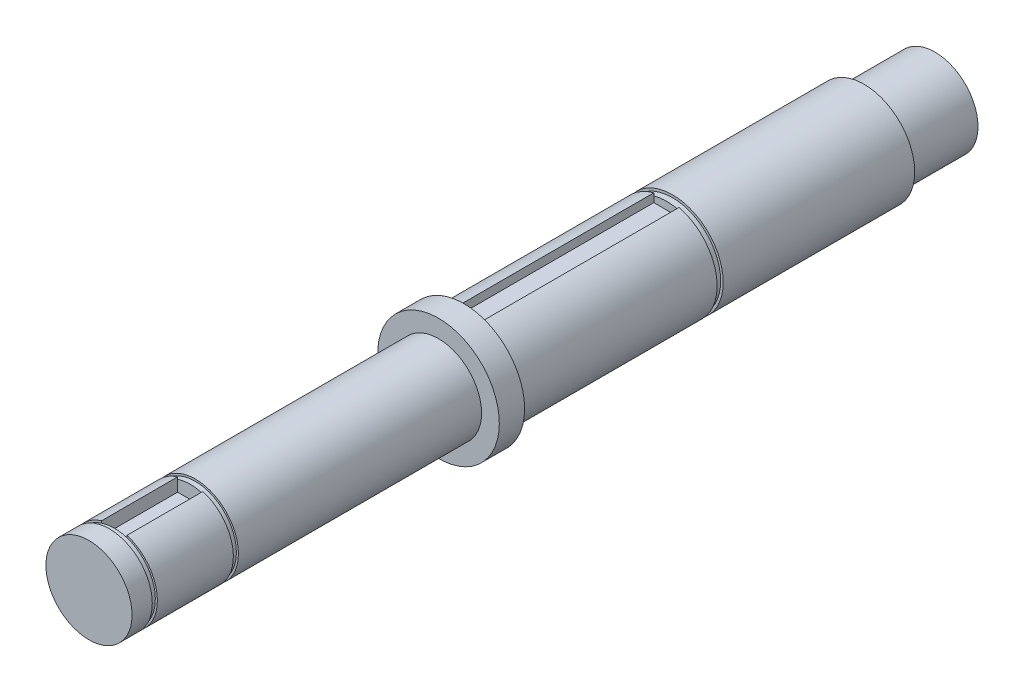
ISO-10303-21;
HEADER;
FILE_DESCRIPTION(('STEP AP214'),'2;1');
FILE_NAME('part.step','',(''),(''),'','','');
FILE_SCHEMA(('AUTOMOTIVE_DESIGN { 1 0 10303 214 1 1 1 1 }'));
ENDSEC;
DATA;
#1=APPLICATION_CONTEXT('core data for automotive mechanical design processes');
#2=APPLICATION_PROTOCOL_DEFINITION('international standard','automotive_design',2000,#1);
#3=PRODUCT_CONTEXT('',#1,'mechanical');
#4=PRODUCT('Part','Part','',(#3));
#5=PRODUCT_RELATED_PRODUCT_CATEGORY('part','',(#4));
#6=PRODUCT_DEFINITION_FORMATION('','',#4);
#7=PRODUCT_DEFINITION_CONTEXT('part definition',#1,'design');
#8=PRODUCT_DEFINITION('design','',#6,#7);
#9=PRODUCT_DEFINITION_SHAPE('','',#8);
#10=(LENGTH_UNIT() NAMED_UNIT(*) SI_UNIT(.MILLI.,.METRE.));
#11=(NAMED_UNIT(*) PLANE_ANGLE_UNIT() SI_UNIT($,.RADIAN.));
#12=(NAMED_UNIT(*) SI_UNIT($,.STERADIAN.) SOLID_ANGLE_UNIT());
#13=UNCERTAINTY_MEASURE_WITH_UNIT(LENGTH_MEASURE(1.E-05),#10,'distance_accuracy_value','');
#14=(GEOMETRIC_REPRESENTATION_CONTEXT(3) GLOBAL_UNCERTAINTY_ASSIGNED_CONTEXT((#13)) GLOBAL_UNIT_ASSIGNED_CONTEXT((#10,
#11,#12)) REPRESENTATION_CONTEXT('',''));
#15=CARTESIAN_POINT('',(0.,0.,0.));
#16=DIRECTION('',(0.,0.,1.));
#17=DIRECTION('',(1.,0.,0.));
#18=AXIS2_PLACEMENT_3D('',#15,#16,#17);
#19=CARTESIAN_POINT('',(0.,0.,0.));
#20=DIRECTION('',(0.,0.,1.));
#21=DIRECTION('',(1.,0.,0.));
#22=AXIS2_PLACEMENT_3D('',#19,#20,#21);
#23=CYLINDRICAL_SURFACE('',#22,8.49999999999999);
#24=CARTESIAN_POINT('',(0.,0.,-14.));
#25=DIRECTION('',(0.,0.,1.));
#26=DIRECTION('',(1.,0.,0.));
#27=AXIS2_PLACEMENT_3D('',#24,#25,#26);
#28=CIRCLE('',#27,8.49999999999999);
#29=CARTESIAN_POINT('',(8.49999999999999,0.,-14.));
#30=VERTEX_POINT('',#29);
#31=EDGE_CURVE('E267',#30,#30,#28,.T.);
#32=ORIENTED_EDGE('',*,*,#31,.T.);
#33=EDGE_LOOP('',(#32));
#34=FACE_BOUND('',#33,.T.);
#35=CARTESIAN_POINT('',(0.,0.,34.));
#36=DIRECTION('',(0.,0.,1.));
#37=DIRECTION('',(1.,0.,0.));
#38=AXIS2_PLACEMENT_3D('',#35,#36,#37);
#39=CIRCLE('',#38,8.49999999999999);
#40=CARTESIAN_POINT('',(8.49999999999999,0.,34.));
#41=VERTEX_POINT('',#40);
#42=EDGE_CURVE('E54',#41,#41,#39,.T.);
#43=ORIENTED_EDGE('',*,*,#42,.F.);
#44=EDGE_LOOP('',(#43));
#45=FACE_BOUND('',#44,.T.);
#46=ADVANCED_FACE('F50',(#34,#45),#23,.T.);
#47=CARTESIAN_POINT('',(0.,0.,-59.));
#48=DIRECTION('',(0.,0.,1.));
#49=DIRECTION('',(1.,0.,0.));
#50=AXIS2_PLACEMENT_3D('',#47,#48,#49);
#51=PLANE('',#50);
#52=DIRECTION('',(0.,1.,0.));
#53=VECTOR('',#52,1.);
#54=CARTESIAN_POINT('',(2.5,8.,-59.));
#55=LINE('',#54,#53);
#56=CARTESIAN_POINT('',(2.5,8.,-59.));
#57=VERTEX_POINT('',#56);
#58=CARTESIAN_POINT('',(2.5,9.16515138991168,-59.));
#59=VERTEX_POINT('',#58);
#60=EDGE_CURVE('E213',#57,#59,#55,.T.);
#61=ORIENTED_EDGE('',*,*,#60,.T.);
#62=CARTESIAN_POINT('',(0.,0.,-59.));
#63=DIRECTION('',(0.,0.,1.));
#64=DIRECTION('',(1.,0.,0.));
#65=AXIS2_PLACEMENT_3D('',#62,#63,#64);
#66=CIRCLE('',#65,9.5);
#67=CARTESIAN_POINT('',(-2.5,9.16515138991168,-59.));
#68=VERTEX_POINT('',#67);
#69=EDGE_CURVE('E205',#59,#68,#66,.T.);
#70=ORIENTED_EDGE('',*,*,#69,.T.);
#71=DIRECTION('',(0.,-1.,0.));
#72=VECTOR('',#71,1.);
#73=CARTESIAN_POINT('',(-2.5,8.,-59.));
#74=LINE('',#73,#72);
#75=CARTESIAN_POINT('',(-2.5,8.,-59.));
#76=VERTEX_POINT('',#75);
#77=EDGE_CURVE('E217',#68,#76,#74,.T.);
#78=ORIENTED_EDGE('',*,*,#77,.T.);
#79=DIRECTION('',(1.,0.,0.));
#80=VECTOR('',#79,1.);
#81=CARTESIAN_POINT('',(2.5,8.,-59.));
#82=LINE('',#81,#80);
#83=EDGE_CURVE('E223',#76,#57,#82,.T.);
#84=ORIENTED_EDGE('',*,*,#83,.T.);
#85=EDGE_LOOP('',(#61,#70,#78,#84));
#86=FACE_BOUND('',#85,.T.);
#87=ADVANCED_FACE('F357',(#86),#51,.T.);
#88=CARTESIAN_POINT('',(0.,8.49999999999999,-14.));
#89=DIRECTION('',(0.,0.,-1.));
#90=DIRECTION('',(-1.,0.,0.));
#91=AXIS2_PLACEMENT_3D('',#88,#89,#90);
#92=PLANE('',#91);
#93=ORIENTED_EDGE('',*,*,#31,.F.);
#94=EDGE_LOOP('',(#93));
#95=FACE_BOUND('',#94,.T.);
#96=CARTESIAN_POINT('',(0.,0.,-14.));
#97=DIRECTION('',(0.,0.,1.));
#98=DIRECTION('',(1.,0.,0.));
#99=AXIS2_PLACEMENT_3D('',#96,#97,#98);
#100=CIRCLE('',#99,12.);
#101=CARTESIAN_POINT('',(12.,0.,-14.));
#102=VERTEX_POINT('',#101);
#103=EDGE_CURVE('E263',#102,#102,#100,.T.);
#104=ORIENTED_EDGE('',*,*,#103,.T.);
#105=EDGE_LOOP('',(#104));
#106=FACE_BOUND('',#105,.T.);
#107=ADVANCED_FACE('F383',(#95,#106),#92,.F.);
#108=CARTESIAN_POINT('',(0.,0.,0.));
#109=DIRECTION('',(0.,0.,1.));
#110=DIRECTION('',(1.,0.,0.));
#111=AXIS2_PLACEMENT_3D('',#108,#109,#110);
#112=CYLINDRICAL_SURFACE('',#111,12.);
#113=ORIENTED_EDGE('',*,*,#103,.F.);
#114=EDGE_LOOP('',(#113));
#115=FACE_BOUND('',#114,.T.);
#116=CARTESIAN_POINT('',(0.,0.,-19.));
#117=DIRECTION('',(0.,0.,1.));
#118=DIRECTION('',(1.,0.,0.));
#119=AXIS2_PLACEMENT_3D('',#116,#117,#118);
#120=CIRCLE('',#119,12.);
#121=CARTESIAN_POINT('',(12.,0.,-19.));
#122=VERTEX_POINT('',#121);
#123=EDGE_CURVE('E259',#122,#122,#120,.T.);
#124=ORIENTED_EDGE('',*,*,#123,.T.);
#125=EDGE_LOOP('',(#124));
#126=FACE_BOUND('',#125,.T.);
#127=ADVANCED_FACE('F638',(#115,#126),#112,.T.);
#128=CARTESIAN_POINT('',(0.,12.,-19.));
#129=DIRECTION('',(0.,0.,1.));
#130=DIRECTION('',(1.,0.,0.));
#131=AXIS2_PLACEMENT_3D('',#128,#129,#130);
#132=PLANE('',#131);
#133=ORIENTED_EDGE('',*,*,#123,.F.);
#134=EDGE_LOOP('',(#133));
#135=FACE_BOUND('',#134,.T.);
#136=CARTESIAN_POINT('',(0.,0.,-19.));
#137=DIRECTION('',(0.,0.,1.));
#138=DIRECTION('',(1.,0.,0.));
#139=AXIS2_PLACEMENT_3D('',#136,#137,#138);
#140=CIRCLE('',#139,9.99999999999999);
#141=CARTESIAN_POINT('',(-2.5,9.68245836551853,-19.));
#142=VERTEX_POINT('',#141);
#143=CARTESIAN_POINT('',(2.5,9.68245836551853,-19.));
#144=VERTEX_POINT('',#143);
#145=EDGE_CURVE('E255',#142,#144,#140,.T.);
#146=ORIENTED_EDGE('',*,*,#145,.T.);
#147=DIRECTION('',(0.,1.,0.));
#148=VECTOR('',#147,1.);
#149=CARTESIAN_POINT('',(2.5,8.,-19.));
#150=LINE('',#149,#148);
#151=CARTESIAN_POINT('',(2.5,8.,-19.));
#152=VERTEX_POINT('',#151);
#153=EDGE_CURVE('E228',#152,#144,#150,.T.);
#154=ORIENTED_EDGE('',*,*,#153,.F.);
#155=DIRECTION('',(1.,0.,0.));
#156=VECTOR('',#155,1.);
#157=CARTESIAN_POINT('',(2.5,8.,-19.));
#158=LINE('',#157,#156);
#159=CARTESIAN_POINT('',(-2.5,8.,-19.));
#160=VERTEX_POINT('',#159);
#161=EDGE_CURVE('E234',#160,#152,#158,.T.);
#162=ORIENTED_EDGE('',*,*,#161,.F.);
#163=DIRECTION('',(0.,-1.,0.));
#164=VECTOR('',#163,1.);
#165=CARTESIAN_POINT('',(-2.5,8.,-19.));
#166=LINE('',#165,#164);
#167=EDGE_CURVE('E231',#142,#160,#166,.T.);
#168=ORIENTED_EDGE('',*,*,#167,.F.);
#169=EDGE_LOOP('',(#146,#154,#162,#168));
#170=FACE_BOUND('',#169,.T.);
#171=ADVANCED_FACE('F348',(#135,#170),#132,.F.);
#172=CARTESIAN_POINT('',(0.,0.,0.));
#173=DIRECTION('',(0.,0.,1.));
#174=DIRECTION('',(1.,0.,0.));
#175=AXIS2_PLACEMENT_3D('',#172,#173,#174);
#176=CYLINDRICAL_SURFACE('',#175,9.99999999999999);
#177=DIRECTION('',(0.,0.,1.));
#178=VECTOR('',#177,1.);
#179=CARTESIAN_POINT('',(-2.5,9.68245836551853,0.));
#180=LINE('',#179,#178);
#181=CARTESIAN_POINT('',(-2.5,9.68245836551853,-59.));
#182=VERTEX_POINT('',#181);
#183=EDGE_CURVE('E271',#142,#182,#180,.F.);
#184=ORIENTED_EDGE('',*,*,#183,.T.);
#185=CARTESIAN_POINT('',(0.,0.,-59.));
#186=DIRECTION('',(0.,0.,1.));
#187=DIRECTION('',(1.,0.,0.));
#188=AXIS2_PLACEMENT_3D('',#185,#186,#187);
#189=CIRCLE('',#188,9.99999999999999);
#190=CARTESIAN_POINT('',(2.5,9.68245836551853,-59.));
#191=VERTEX_POINT('',#190);
#192=EDGE_CURVE('E204',#182,#191,#189,.T.);
#193=ORIENTED_EDGE('',*,*,#192,.T.);
#194=DIRECTION('',(0.,0.,1.));
#195=VECTOR('',#194,1.);
#196=CARTESIAN_POINT('',(2.5,9.68245836551853,0.));
#197=LINE('',#196,#195);
#198=EDGE_CURVE('E275',#191,#144,#197,.T.);
#199=ORIENTED_EDGE('',*,*,#198,.T.);
#200=ORIENTED_EDGE('',*,*,#145,.F.);
#201=EDGE_LOOP('',(#184,#193,#199,#200));
#202=FACE_BOUND('',#201,.T.);
#203=ADVANCED_FACE('F341',(#202),#176,.T.);
#204=CARTESIAN_POINT('',(2.5,8.,-59.));
#205=DIRECTION('',(1.,0.,0.));
#206=DIRECTION('',(0.,0.,-1.));
#207=AXIS2_PLACEMENT_3D('',#204,#205,#206);
#208=PLANE('',#207);
#209=ORIENTED_EDGE('',*,*,#60,.F.);
#210=DIRECTION('',(0.,0.,1.));
#211=VECTOR('',#210,1.);
#212=CARTESIAN_POINT('',(2.5,8.,-59.));
#213=LINE('',#212,#211);
#214=EDGE_CURVE('E238',#57,#152,#213,.T.);
#215=ORIENTED_EDGE('',*,*,#214,.T.);
#216=ORIENTED_EDGE('',*,*,#153,.T.);
#217=ORIENTED_EDGE('',*,*,#198,.F.);
#218=EDGE_CURVE('E218',#59,#191,#55,.T.);
#219=ORIENTED_EDGE('',*,*,#218,.F.);
#220=EDGE_LOOP('',(#209,#215,#216,#217,#219));
#221=FACE_BOUND('',#220,.T.);
#222=ADVANCED_FACE('F344',(#221),#208,.F.);
#223=CARTESIAN_POINT('',(-2.5,8.,-59.));
#224=DIRECTION('',(-1.,0.,0.));
#225=DIRECTION('',(0.,-1.,0.));
#226=AXIS2_PLACEMENT_3D('',#223,#224,#225);
#227=PLANE('',#226);
#228=ORIENTED_EDGE('',*,*,#167,.T.);
#229=DIRECTION('',(0.,0.,1.));
#230=VECTOR('',#229,1.);
#231=CARTESIAN_POINT('',(-2.5,8.,-59.));
#232=LINE('',#231,#230);
#233=EDGE_CURVE('E227',#76,#160,#232,.T.);
#234=ORIENTED_EDGE('',*,*,#233,.F.);
#235=ORIENTED_EDGE('',*,*,#77,.F.);
#236=EDGE_CURVE('E219',#182,#68,#74,.T.);
#237=ORIENTED_EDGE('',*,*,#236,.F.);
#238=ORIENTED_EDGE('',*,*,#183,.F.);
#239=EDGE_LOOP('',(#228,#234,#235,#237,#238));
#240=FACE_BOUND('',#239,.T.);
#241=ADVANCED_FACE('F355',(#240),#227,.F.);
#242=CARTESIAN_POINT('',(2.5,8.,-59.));
#243=DIRECTION('',(0.,-1.,0.));
#244=DIRECTION('',(0.,0.,-1.));
#245=AXIS2_PLACEMENT_3D('',#242,#243,#244);
#246=PLANE('',#245);
#247=ORIENTED_EDGE('',*,*,#161,.T.);
#248=ORIENTED_EDGE('',*,*,#214,.F.);
#249=ORIENTED_EDGE('',*,*,#83,.F.);
#250=ORIENTED_EDGE('',*,*,#233,.T.);
#251=EDGE_LOOP('',(#247,#248,#249,#250));
#252=FACE_BOUND('',#251,.T.);
#253=ADVANCED_FACE('F350',(#252),#246,.F.);
#254=CARTESIAN_POINT('',(0.,0.,-60.2));
#255=DIRECTION('',(0.,0.,1.));
#256=DIRECTION('',(1.,0.,0.));
#257=AXIS2_PLACEMENT_3D('',#254,#255,#256);
#258=PLANE('',#257);
#259=CARTESIAN_POINT('',(0.,0.,-60.2));
#260=DIRECTION('',(0.,0.,1.));
#261=DIRECTION('',(1.,0.,0.));
#262=AXIS2_PLACEMENT_3D('',#259,#260,#261);
#263=CIRCLE('',#262,9.5);
#264=CARTESIAN_POINT('',(9.5,0.,-60.2));
#265=VERTEX_POINT('',#264);
#266=EDGE_CURVE('E200',#265,#265,#263,.T.);
#267=ORIENTED_EDGE('',*,*,#266,.F.);
#268=EDGE_LOOP('',(#267));
#269=FACE_BOUND('',#268,.T.);
#270=CARTESIAN_POINT('',(0.,0.,-60.2));
#271=DIRECTION('',(0.,0.,1.));
#272=DIRECTION('',(1.,0.,0.));
#273=AXIS2_PLACEMENT_3D('',#270,#271,#272);
#274=CIRCLE('',#273,9.99999999999999);
#275=CARTESIAN_POINT('',(9.99999999999999,0.,-60.2));
#276=VERTEX_POINT('',#275);
#277=EDGE_CURVE('E212',#276,#276,#274,.T.);
#278=ORIENTED_EDGE('',*,*,#277,.T.);
#279=EDGE_LOOP('',(#278));
#280=FACE_BOUND('',#279,.T.);
#281=ADVANCED_FACE('F373',(#269,#280),#258,.T.);
#282=CARTESIAN_POINT('',(0.,0.,-59.));
#283=DIRECTION('',(0.,0.,1.));
#284=DIRECTION('',(1.,0.,0.));
#285=AXIS2_PLACEMENT_3D('',#282,#283,#284);
#286=PLANE('',#285);
#287=ORIENTED_EDGE('',*,*,#192,.F.);
#288=ORIENTED_EDGE('',*,*,#236,.T.);
#289=EDGE_CURVE('E199',#68,#59,#66,.T.);
#290=ORIENTED_EDGE('',*,*,#289,.T.);
#291=ORIENTED_EDGE('',*,*,#218,.T.);
#292=EDGE_LOOP('',(#287,#288,#290,#291));
#293=FACE_BOUND('',#292,.T.);
#294=ADVANCED_FACE('F334',(#293),#286,.F.);
#295=CARTESIAN_POINT('',(0.,0.,-60.2));
#296=DIRECTION('',(0.,0.,1.));
#297=DIRECTION('',(1.,0.,0.));
#298=AXIS2_PLACEMENT_3D('',#295,#296,#297);
#299=CYLINDRICAL_SURFACE('',#298,9.5);
#300=ORIENTED_EDGE('',*,*,#266,.T.);
#301=EDGE_LOOP('',(#300));
#302=FACE_BOUND('',#301,.T.);
#303=ORIENTED_EDGE('',*,*,#69,.F.);
#304=ORIENTED_EDGE('',*,*,#289,.F.);
#305=EDGE_LOOP('',(#303,#304));
#306=FACE_BOUND('',#305,.T.);
#307=ADVANCED_FACE('F359',(#302,#306),#299,.T.);
#308=CARTESIAN_POINT('',(0.,8.49999999999997,-112.));
#309=DIRECTION('',(0.,0.,1.));
#310=DIRECTION('',(1.,0.,0.));
#311=AXIS2_PLACEMENT_3D('',#308,#309,#310);
#312=PLANE('',#311);
#313=CARTESIAN_POINT('',(0.,0.,-112.));
#314=DIRECTION('',(0.,0.,1.));
#315=DIRECTION('',(1.,0.,0.));
#316=AXIS2_PLACEMENT_3D('',#313,#314,#315);
#317=CIRCLE('',#316,8.49999999999997);
#318=CARTESIAN_POINT('',(8.49999999999997,0.,-112.));
#319=VERTEX_POINT('',#318);
#320=EDGE_CURVE('E241',#319,#319,#317,.T.);
#321=ORIENTED_EDGE('',*,*,#320,.F.);
#322=EDGE_LOOP('',(#321));
#323=FACE_BOUND('',#322,.T.);
#324=ADVANCED_FACE('F363',(#323),#312,.F.);
#325=CARTESIAN_POINT('',(0.,0.,0.));
#326=DIRECTION('',(0.,0.,1.));
#327=DIRECTION('',(1.,0.,0.));
#328=AXIS2_PLACEMENT_3D('',#325,#326,#327);
#329=CYLINDRICAL_SURFACE('',#328,8.49999999999997);
#330=CARTESIAN_POINT('',(0.,0.,-98.));
#331=DIRECTION('',(0.,0.,1.));
#332=DIRECTION('',(1.,0.,0.));
#333=AXIS2_PLACEMENT_3D('',#330,#331,#332);
#334=CIRCLE('',#333,8.49999999999997);
#335=CARTESIAN_POINT('',(8.49999999999997,0.,-98.));
#336=VERTEX_POINT('',#335);
#337=EDGE_CURVE('E248',#336,#336,#334,.T.);
#338=ORIENTED_EDGE('',*,*,#337,.F.);
#339=EDGE_LOOP('',(#338));
#340=FACE_BOUND('',#339,.T.);
#341=ORIENTED_EDGE('',*,*,#320,.T.);
#342=EDGE_LOOP('',(#341));
#343=FACE_BOUND('',#342,.T.);
#344=ADVANCED_FACE('F370',(#340,#343),#329,.T.);
#345=CARTESIAN_POINT('',(0.,9.99999999999999,-98.));
#346=DIRECTION('',(0.,0.,1.));
#347=DIRECTION('',(1.,0.,0.));
#348=AXIS2_PLACEMENT_3D('',#345,#346,#347);
#349=PLANE('',#348);
#350=CARTESIAN_POINT('',(0.,0.,-98.));
#351=DIRECTION('',(0.,0.,1.));
#352=DIRECTION('',(1.,0.,0.));
#353=AXIS2_PLACEMENT_3D('',#350,#351,#352);
#354=CIRCLE('',#353,9.99999999999999);
#355=CARTESIAN_POINT('',(9.99999999999999,0.,-98.));
#356=VERTEX_POINT('',#355);
#357=EDGE_CURVE('E251',#356,#356,#354,.T.);
#358=ORIENTED_EDGE('',*,*,#357,.F.);
#359=EDGE_LOOP('',(#358));
#360=FACE_BOUND('',#359,.T.);
#361=ORIENTED_EDGE('',*,*,#337,.T.);
#362=EDGE_LOOP('',(#361));
#363=FACE_BOUND('',#362,.T.);
#364=ADVANCED_FACE('F551',(#360,#363),#349,.F.);
#365=ORIENTED_EDGE('',*,*,#357,.T.);
#366=EDGE_LOOP('',(#365));
#367=FACE_BOUND('',#366,.T.);
#368=ORIENTED_EDGE('',*,*,#277,.F.);
#369=EDGE_LOOP('',(#368));
#370=FACE_BOUND('',#369,.T.);
#371=ADVANCED_FACE('F312',(#367,#370),#176,.T.);
#372=CARTESIAN_POINT('',(0.,0.,34.));
#373=DIRECTION('',(0.,0.,1.));
#374=DIRECTION('',(1.,0.,0.));
#375=AXIS2_PLACEMENT_3D('',#372,#373,#374);
#376=PLANE('',#375);
#377=CARTESIAN_POINT('',(0.,0.,34.));
#378=DIRECTION('',(0.,0.,1.));
#379=DIRECTION('',(1.,0.,0.));
#380=AXIS2_PLACEMENT_3D('',#377,#378,#379);
#381=CIRCLE('',#380,8.1);
#382=CARTESIAN_POINT('',(8.1,0.,34.));
#383=VERTEX_POINT('',#382);
#384=EDGE_CURVE('E161',#383,#383,#381,.T.);
#385=ORIENTED_EDGE('',*,*,#384,.F.);
#386=EDGE_LOOP('',(#385));
#387=FACE_BOUND('',#386,.T.);
#388=ORIENTED_EDGE('',*,*,#42,.T.);
#389=EDGE_LOOP('',(#388));
#390=FACE_BOUND('',#389,.T.);
#391=ADVANCED_FACE('F309',(#387,#390),#376,.T.);
#392=CARTESIAN_POINT('',(0.,0.,35.));
#393=DIRECTION('',(0.,0.,1.));
#394=DIRECTION('',(1.,0.,0.));
#395=AXIS2_PLACEMENT_3D('',#392,#393,#394);
#396=PLANE('',#395);
#397=CARTESIAN_POINT('',(0.,0.,35.));
#398=DIRECTION('',(0.,0.,1.));
#399=DIRECTION('',(1.,0.,0.));
#400=AXIS2_PLACEMENT_3D('',#397,#398,#399);
#401=CIRCLE('',#400,8.1);
#402=CARTESIAN_POINT('',(-2.5,7.70454411370329,35.));
#403=VERTEX_POINT('',#402);
#404=CARTESIAN_POINT('',(2.5,7.70454411370329,35.));
#405=VERTEX_POINT('',#404);
#406=EDGE_CURVE('E138',#403,#405,#401,.T.);
#407=ORIENTED_EDGE('',*,*,#406,.T.);
#408=DIRECTION('',(0.,1.,0.));
#409=VECTOR('',#408,1.);
#410=CARTESIAN_POINT('',(2.5,8.49999999999999,35.));
#411=LINE('',#410,#409);
#412=CARTESIAN_POINT('',(2.5,8.12403840463595,35.));
#413=VERTEX_POINT('',#412);
#414=EDGE_CURVE('E179',#405,#413,#411,.T.);
#415=ORIENTED_EDGE('',*,*,#414,.T.);
#416=CARTESIAN_POINT('',(0.,0.,35.));
#417=DIRECTION('',(0.,0.,1.));
#418=DIRECTION('',(1.,0.,0.));
#419=AXIS2_PLACEMENT_3D('',#416,#417,#418);
#420=CIRCLE('',#419,8.49999999999999);
#421=CARTESIAN_POINT('',(-2.5,8.12403840463595,35.));
#422=VERTEX_POINT('',#421);
#423=EDGE_CURVE('E141',#422,#413,#420,.T.);
#424=ORIENTED_EDGE('',*,*,#423,.F.);
#425=DIRECTION('',(0.,-1.,0.));
#426=VECTOR('',#425,1.);
#427=CARTESIAN_POINT('',(-2.5,8.49999999999999,35.));
#428=LINE('',#427,#426);
#429=EDGE_CURVE('E136',#422,#403,#428,.T.);
#430=ORIENTED_EDGE('',*,*,#429,.T.);
#431=EDGE_LOOP('',(#407,#415,#424,#430));
#432=FACE_BOUND('',#431,.T.);
#433=ADVANCED_FACE('F137',(#432),#396,.F.);
#434=CARTESIAN_POINT('',(0.,0.,34.));
#435=DIRECTION('',(0.,0.,1.));
#436=DIRECTION('',(1.,0.,0.));
#437=AXIS2_PLACEMENT_3D('',#434,#435,#436);
#438=CYLINDRICAL_SURFACE('',#437,8.1);
#439=ORIENTED_EDGE('',*,*,#384,.T.);
#440=EDGE_LOOP('',(#439));
#441=FACE_BOUND('',#440,.T.);
#442=EDGE_CURVE('E67',#405,#403,#401,.T.);
#443=ORIENTED_EDGE('',*,*,#442,.F.);
#444=ORIENTED_EDGE('',*,*,#406,.F.);
#445=EDGE_LOOP('',(#443,#444));
#446=FACE_BOUND('',#445,.T.);
#447=ADVANCED_FACE('F150',(#441,#446),#438,.T.);
#448=CARTESIAN_POINT('',(0.,0.,55.));
#449=DIRECTION('',(0.,0.,1.));
#450=DIRECTION('',(1.,0.,0.));
#451=AXIS2_PLACEMENT_3D('',#448,#449,#450);
#452=PLANE('',#451);
#453=CARTESIAN_POINT('',(0.,0.,55.));
#454=DIRECTION('',(0.,0.,1.));
#455=DIRECTION('',(1.,0.,0.));
#456=AXIS2_PLACEMENT_3D('',#453,#454,#455);
#457=CIRCLE('',#456,8.49999999999999);
#458=CARTESIAN_POINT('',(8.49999999999999,0.,55.));
#459=VERTEX_POINT('',#458);
#460=EDGE_CURVE('E175',#459,#459,#457,.T.);
#461=ORIENTED_EDGE('',*,*,#460,.T.);
#462=EDGE_LOOP('',(#461));
#463=FACE_BOUND('',#462,.T.);
#464=ADVANCED_FACE('F387',(#463),#452,.T.);
#465=ORIENTED_EDGE('',*,*,#460,.F.);
#466=EDGE_LOOP('',(#465));
#467=FACE_BOUND('',#466,.T.);
#468=CARTESIAN_POINT('',(0.,0.,51.));
#469=DIRECTION('',(0.,0.,-1.));
#470=DIRECTION('',(-1.,0.,0.));
#471=AXIS2_PLACEMENT_3D('',#468,#469,#470);
#472=CIRCLE('',#471,8.49999999999999);
#473=CARTESIAN_POINT('',(-8.49999999999999,0.,51.));
#474=VERTEX_POINT('',#473);
#475=EDGE_CURVE('E281',#474,#474,#472,.T.);
#476=ORIENTED_EDGE('',*,*,#475,.F.);
#477=EDGE_LOOP('',(#476));
#478=FACE_BOUND('',#477,.T.);
#479=ADVANCED_FACE('F379',(#467,#478),#23,.T.);
#480=CARTESIAN_POINT('',(0.,0.,51.));
#481=DIRECTION('',(0.,0.,-1.));
#482=DIRECTION('',(-1.,0.,0.));
#483=AXIS2_PLACEMENT_3D('',#480,#481,#482);
#484=PLANE('',#483);
#485=CARTESIAN_POINT('',(0.,0.,51.));
#486=DIRECTION('',(0.,0.,-1.));
#487=DIRECTION('',(-1.,0.,0.));
#488=AXIS2_PLACEMENT_3D('',#485,#486,#487);
#489=CIRCLE('',#488,8.1);
#490=CARTESIAN_POINT('',(-8.1,0.,51.));
#491=VERTEX_POINT('',#490);
#492=EDGE_CURVE('E292',#491,#491,#489,.T.);
#493=ORIENTED_EDGE('',*,*,#492,.F.);
#494=EDGE_LOOP('',(#493));
#495=FACE_BOUND('',#494,.T.);
#496=ORIENTED_EDGE('',*,*,#475,.T.);
#497=EDGE_LOOP('',(#496));
#498=FACE_BOUND('',#497,.T.);
#499=ADVANCED_FACE('F386',(#495,#498),#484,.T.);
#500=CARTESIAN_POINT('',(0.,0.,51.));
#501=DIRECTION('',(0.,0.,-1.));
#502=DIRECTION('',(-1.,0.,0.));
#503=AXIS2_PLACEMENT_3D('',#500,#501,#502);
#504=CYLINDRICAL_SURFACE('',#503,8.1);
#505=ORIENTED_EDGE('',*,*,#492,.T.);
#506=EDGE_LOOP('',(#505));
#507=FACE_BOUND('',#506,.T.);
#508=CARTESIAN_POINT('',(0.,0.,50.));
#509=DIRECTION('',(0.,0.,-1.));
#510=DIRECTION('',(-1.,0.,0.));
#511=AXIS2_PLACEMENT_3D('',#508,#509,#510);
#512=CIRCLE('',#511,8.1);
#513=CARTESIAN_POINT('',(-2.5,7.70454411370329,50.));
#514=VERTEX_POINT('',#513);
#515=CARTESIAN_POINT('',(2.5,7.70454411370329,50.));
#516=VERTEX_POINT('',#515);
#517=EDGE_CURVE('E296',#514,#516,#512,.T.);
#518=ORIENTED_EDGE('',*,*,#517,.F.);
#519=EDGE_CURVE('E74',#516,#514,#512,.T.);
#520=ORIENTED_EDGE('',*,*,#519,.F.);
#521=EDGE_LOOP('',(#518,#520));
#522=FACE_BOUND('',#521,.T.);
#523=ADVANCED_FACE('F323',(#507,#522),#504,.T.);
#524=CARTESIAN_POINT('',(0.,0.,50.));
#525=DIRECTION('',(0.,0.,-1.));
#526=DIRECTION('',(-1.,0.,0.));
#527=AXIS2_PLACEMENT_3D('',#524,#525,#526);
#528=PLANE('',#527);
#529=CARTESIAN_POINT('',(0.,0.,50.));
#530=DIRECTION('',(0.,0.,-1.));
#531=DIRECTION('',(-1.,0.,0.));
#532=AXIS2_PLACEMENT_3D('',#529,#530,#531);
#533=CIRCLE('',#532,8.49999999999999);
#534=CARTESIAN_POINT('',(2.5,8.12403840463595,50.));
#535=VERTEX_POINT('',#534);
#536=CARTESIAN_POINT('',(-2.5,8.12403840463595,50.));
#537=VERTEX_POINT('',#536);
#538=EDGE_CURVE('E284',#535,#537,#533,.T.);
#539=ORIENTED_EDGE('',*,*,#538,.F.);
#540=DIRECTION('',(0.,1.,0.));
#541=VECTOR('',#540,1.);
#542=CARTESIAN_POINT('',(2.5,8.49999999999999,50.));
#543=LINE('',#542,#541);
#544=EDGE_CURVE('E171',#516,#535,#543,.T.);
#545=ORIENTED_EDGE('',*,*,#544,.F.);
#546=ORIENTED_EDGE('',*,*,#519,.T.);
#547=DIRECTION('',(0.,-1.,0.));
#548=VECTOR('',#547,1.);
#549=CARTESIAN_POINT('',(-2.5,0.,50.));
#550=LINE('',#549,#548);
#551=EDGE_CURVE('E11',#537,#514,#550,.T.);
#552=ORIENTED_EDGE('',*,*,#551,.F.);
#553=EDGE_LOOP('',(#539,#545,#546,#552));
#554=FACE_BOUND('',#553,.T.);
#555=ADVANCED_FACE('F320',(#554),#528,.F.);
#556=CARTESIAN_POINT('',(0.,0.,50.));
#557=DIRECTION('',(0.,0.,1.));
#558=DIRECTION('',(1.,0.,0.));
#559=AXIS2_PLACEMENT_3D('',#556,#557,#558);
#560=PLANE('',#559);
#561=ORIENTED_EDGE('',*,*,#517,.T.);
#562=CARTESIAN_POINT('',(2.5,5.49999999999998,50.));
#563=VERTEX_POINT('',#562);
#564=EDGE_CURVE('E167',#563,#516,#543,.T.);
#565=ORIENTED_EDGE('',*,*,#564,.F.);
#566=DIRECTION('',(1.,0.,0.));
#567=VECTOR('',#566,1.);
#568=CARTESIAN_POINT('',(-2.5,5.49999999999999,50.));
#569=LINE('',#568,#567);
#570=CARTESIAN_POINT('',(-2.5,5.49999999999999,50.));
#571=VERTEX_POINT('',#570);
#572=EDGE_CURVE('E182',#571,#563,#569,.T.);
#573=ORIENTED_EDGE('',*,*,#572,.F.);
#574=EDGE_CURVE('E60',#514,#571,#550,.T.);
#575=ORIENTED_EDGE('',*,*,#574,.F.);
#576=EDGE_LOOP('',(#561,#565,#573,#575));
#577=FACE_BOUND('',#576,.T.);
#578=ADVANCED_FACE('F326',(#577),#560,.F.);
#579=CARTESIAN_POINT('',(-2.5,5.49999999999999,35.));
#580=DIRECTION('',(0.,-1.,0.));
#581=DIRECTION('',(1.,0.,0.));
#582=AXIS2_PLACEMENT_3D('',#579,#580,#581);
#583=PLANE('',#582);
#584=ORIENTED_EDGE('',*,*,#572,.T.);
#585=DIRECTION('',(0.,0.,1.));
#586=VECTOR('',#585,1.);
#587=CARTESIAN_POINT('',(2.5,5.49999999999998,35.));
#588=LINE('',#587,#586);
#589=CARTESIAN_POINT('',(2.5,5.49999999999998,35.));
#590=VERTEX_POINT('',#589);
#591=EDGE_CURVE('E186',#590,#563,#588,.T.);
#592=ORIENTED_EDGE('',*,*,#591,.F.);
#593=DIRECTION('',(1.,0.,0.));
#594=VECTOR('',#593,1.);
#595=CARTESIAN_POINT('',(-2.5,5.49999999999999,35.));
#596=LINE('',#595,#594);
#597=CARTESIAN_POINT('',(-2.5,5.49999999999999,35.));
#598=VERTEX_POINT('',#597);
#599=EDGE_CURVE('E147',#598,#590,#596,.T.);
#600=ORIENTED_EDGE('',*,*,#599,.F.);
#601=DIRECTION('',(0.,0.,1.));
#602=VECTOR('',#601,1.);
#603=CARTESIAN_POINT('',(-2.5,5.49999999999999,35.));
#604=LINE('',#603,#602);
#605=EDGE_CURVE('E164',#598,#571,#604,.T.);
#606=ORIENTED_EDGE('',*,*,#605,.T.);
#607=EDGE_LOOP('',(#584,#592,#600,#606));
#608=FACE_BOUND('',#607,.T.);
#609=ADVANCED_FACE('F401',(#608),#583,.F.);
#610=CARTESIAN_POINT('',(-2.5,8.49999999999999,35.));
#611=DIRECTION('',(-1.,0.,0.));
#612=DIRECTION('',(0.,-1.,0.));
#613=AXIS2_PLACEMENT_3D('',#610,#611,#612);
#614=PLANE('',#613);
#615=ORIENTED_EDGE('',*,*,#551,.T.);
#616=ORIENTED_EDGE('',*,*,#574,.T.);
#617=ORIENTED_EDGE('',*,*,#605,.F.);
#618=EDGE_CURVE('E148',#403,#598,#428,.T.);
#619=ORIENTED_EDGE('',*,*,#618,.F.);
#620=ORIENTED_EDGE('',*,*,#429,.F.);
#621=DIRECTION('',(0.,0.,1.));
#622=VECTOR('',#621,1.);
#623=CARTESIAN_POINT('',(-2.5,8.12403840463595,0.));
#624=LINE('',#623,#622);
#625=EDGE_CURVE('E196',#537,#422,#624,.F.);
#626=ORIENTED_EDGE('',*,*,#625,.F.);
#627=EDGE_LOOP('',(#615,#616,#617,#619,#620,#626));
#628=FACE_BOUND('',#627,.T.);
#629=ADVANCED_FACE('F162',(#628),#614,.F.);
#630=CARTESIAN_POINT('',(2.5,8.49999999999999,35.));
#631=DIRECTION('',(1.,0.,0.));
#632=DIRECTION('',(0.,1.,0.));
#633=AXIS2_PLACEMENT_3D('',#630,#631,#632);
#634=PLANE('',#633);
#635=EDGE_CURVE('E159',#590,#405,#411,.T.);
#636=ORIENTED_EDGE('',*,*,#635,.F.);
#637=ORIENTED_EDGE('',*,*,#591,.T.);
#638=ORIENTED_EDGE('',*,*,#564,.T.);
#639=ORIENTED_EDGE('',*,*,#544,.T.);
#640=DIRECTION('',(0.,0.,1.));
#641=VECTOR('',#640,1.);
#642=CARTESIAN_POINT('',(2.5,8.12403840463595,0.));
#643=LINE('',#642,#641);
#644=EDGE_CURVE('E190',#413,#535,#643,.T.);
#645=ORIENTED_EDGE('',*,*,#644,.F.);
#646=ORIENTED_EDGE('',*,*,#414,.F.);
#647=EDGE_LOOP('',(#636,#637,#638,#639,#645,#646));
#648=FACE_BOUND('',#647,.T.);
#649=ADVANCED_FACE('F330',(#648),#634,.F.);
#650=CARTESIAN_POINT('',(0.,0.,35.));
#651=DIRECTION('',(0.,0.,1.));
#652=DIRECTION('',(1.,0.,0.));
#653=AXIS2_PLACEMENT_3D('',#650,#651,#652);
#654=PLANE('',#653);
#655=ORIENTED_EDGE('',*,*,#635,.T.);
#656=ORIENTED_EDGE('',*,*,#442,.T.);
#657=ORIENTED_EDGE('',*,*,#618,.T.);
#658=ORIENTED_EDGE('',*,*,#599,.T.);
#659=EDGE_LOOP('',(#655,#656,#657,#658));
#660=FACE_BOUND('',#659,.T.);
#661=ADVANCED_FACE('F155',(#660),#654,.T.);
#662=ORIENTED_EDGE('',*,*,#625,.T.);
#663=ORIENTED_EDGE('',*,*,#423,.T.);
#664=ORIENTED_EDGE('',*,*,#644,.T.);
#665=ORIENTED_EDGE('',*,*,#538,.T.);
#666=EDGE_LOOP('',(#662,#663,#664,#665));
#667=FACE_BOUND('',#666,.T.);
#668=ADVANCED_FACE('F52',(#667),#23,.T.);
#669=CLOSED_SHELL('',(#46,#87,#107,#127,#171,#203,#222,#241,#253,#281,#294,#307,#324,#344,#364,
#371,#391,#433,#447,#464,#479,#499,#523,#555,#578,#609,#629,#649,#661,#668));
#670=MANIFOLD_SOLID_BREP('B2',#669);
#671=ADVANCED_BREP_SHAPE_REPRESENTATION('',(#18,#670),#14);
#672=SHAPE_DEFINITION_REPRESENTATION(#9,#671);
ENDSEC;
END-ISO-10303-21;
